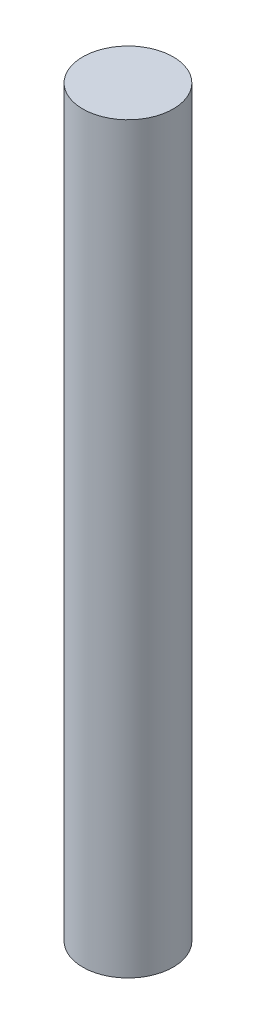
ISO-10303-21;
HEADER;
FILE_DESCRIPTION(('STEP AP214'),'2;1');
FILE_NAME('part.step','',(''),(''),'','','');
FILE_SCHEMA(('AUTOMOTIVE_DESIGN { 1 0 10303 214 1 1 1 1 }'));
ENDSEC;
DATA;
#1=APPLICATION_CONTEXT('core data for automotive mechanical design processes');
#2=APPLICATION_PROTOCOL_DEFINITION('international standard','automotive_design',2000,#1);
#3=PRODUCT_CONTEXT('',#1,'mechanical');
#4=PRODUCT('Part','Part','',(#3));
#5=PRODUCT_RELATED_PRODUCT_CATEGORY('part','',(#4));
#6=PRODUCT_DEFINITION_FORMATION('','',#4);
#7=PRODUCT_DEFINITION_CONTEXT('part definition',#1,'design');
#8=PRODUCT_DEFINITION('design','',#6,#7);
#9=PRODUCT_DEFINITION_SHAPE('','',#8);
#10=(LENGTH_UNIT() NAMED_UNIT(*) SI_UNIT(.MILLI.,.METRE.));
#11=(NAMED_UNIT(*) PLANE_ANGLE_UNIT() SI_UNIT($,.RADIAN.));
#12=(NAMED_UNIT(*) SI_UNIT($,.STERADIAN.) SOLID_ANGLE_UNIT());
#13=UNCERTAINTY_MEASURE_WITH_UNIT(LENGTH_MEASURE(1.E-05),#10,'distance_accuracy_value','');
#14=(GEOMETRIC_REPRESENTATION_CONTEXT(3) GLOBAL_UNCERTAINTY_ASSIGNED_CONTEXT((#13)) GLOBAL_UNIT_ASSIGNED_CONTEXT((#10,
#11,#12)) REPRESENTATION_CONTEXT('',''));
#15=CARTESIAN_POINT('',(0.,0.,0.));
#16=DIRECTION('',(0.,0.,1.));
#17=DIRECTION('',(1.,0.,0.));
#18=AXIS2_PLACEMENT_3D('',#15,#16,#17);
#19=CARTESIAN_POINT('',(0.,37.,0.));
#20=DIRECTION('',(0.,-1.,0.));
#21=DIRECTION('',(0.,0.,-1.));
#22=AXIS2_PLACEMENT_3D('',#19,#20,#21);
#23=CYLINDRICAL_SURFACE('',#22,2.25);
#24=CARTESIAN_POINT('',(0.,37.,0.));
#25=DIRECTION('',(0.,1.,0.));
#26=DIRECTION('',(0.,0.,1.));
#27=AXIS2_PLACEMENT_3D('',#24,#25,#26);
#28=CIRCLE('',#27,2.25);
#29=CARTESIAN_POINT('',(0.,37.,2.25));
#30=VERTEX_POINT('',#29);
#31=EDGE_CURVE('E10',#30,#30,#28,.T.);
#32=ORIENTED_EDGE('',*,*,#31,.F.);
#33=EDGE_LOOP('',(#32));
#34=FACE_BOUND('',#33,.T.);
#35=CARTESIAN_POINT('',(0.,0.,0.));
#36=DIRECTION('',(0.,1.,0.));
#37=DIRECTION('',(0.,0.,1.));
#38=AXIS2_PLACEMENT_3D('',#35,#36,#37);
#39=CIRCLE('',#38,2.25);
#40=CARTESIAN_POINT('',(0.,0.,2.25));
#41=VERTEX_POINT('',#40);
#42=EDGE_CURVE('E43',#41,#41,#39,.T.);
#43=ORIENTED_EDGE('',*,*,#42,.T.);
#44=EDGE_LOOP('',(#43));
#45=FACE_BOUND('',#44,.T.);
#46=ADVANCED_FACE('F40',(#34,#45),#23,.T.);
#47=CARTESIAN_POINT('',(0.,37.,0.));
#48=DIRECTION('',(0.,1.,0.));
#49=DIRECTION('',(0.,0.,1.));
#50=AXIS2_PLACEMENT_3D('',#47,#48,#49);
#51=PLANE('',#50);
#52=ORIENTED_EDGE('',*,*,#31,.T.);
#53=EDGE_LOOP('',(#52));
#54=FACE_BOUND('',#53,.T.);
#55=ADVANCED_FACE('F55',(#54),#51,.T.);
#56=CARTESIAN_POINT('',(0.,0.,0.));
#57=DIRECTION('',(0.,1.,0.));
#58=DIRECTION('',(0.,0.,1.));
#59=AXIS2_PLACEMENT_3D('',#56,#57,#58);
#60=PLANE('',#59);
#61=ORIENTED_EDGE('',*,*,#42,.F.);
#62=EDGE_LOOP('',(#61));
#63=FACE_BOUND('',#62,.T.);
#64=ADVANCED_FACE('F53',(#63),#60,.F.);
#65=CLOSED_SHELL('',(#46,#55,#64));
#66=MANIFOLD_SOLID_BREP('B2',#65);
#67=ADVANCED_BREP_SHAPE_REPRESENTATION('',(#18,#66),#14);
#68=SHAPE_DEFINITION_REPRESENTATION(#9,#67);
ENDSEC;
END-ISO-10303-21;
